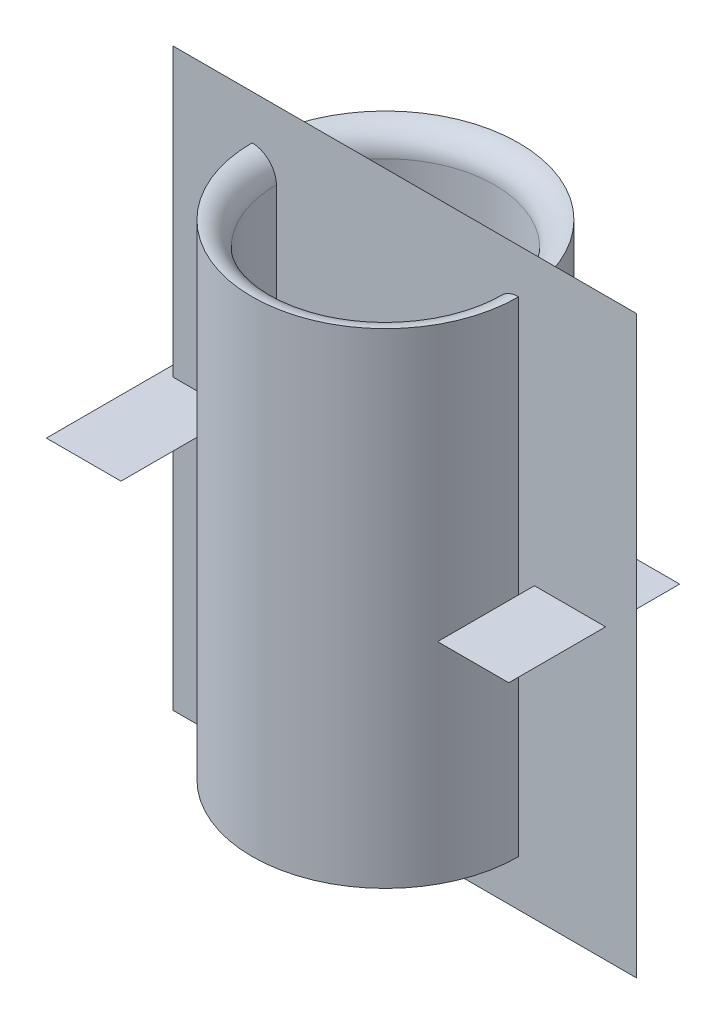
ISO-10303-21;
HEADER;
FILE_DESCRIPTION(('STEP AP214'),'2;1');
FILE_NAME('part.step','',(''),(''),'','','');
FILE_SCHEMA(('AUTOMOTIVE_DESIGN { 1 0 10303 214 1 1 1 1 }'));
ENDSEC;
DATA;
#1=APPLICATION_CONTEXT('core data for automotive mechanical design processes');
#2=APPLICATION_PROTOCOL_DEFINITION('international standard','automotive_design',2000,#1);
#3=PRODUCT_CONTEXT('',#1,'mechanical');
#4=PRODUCT('Part','Part','',(#3));
#5=PRODUCT_RELATED_PRODUCT_CATEGORY('part','',(#4));
#6=PRODUCT_DEFINITION_FORMATION('','',#4);
#7=PRODUCT_DEFINITION_CONTEXT('part definition',#1,'design');
#8=PRODUCT_DEFINITION('design','',#6,#7);
#9=PRODUCT_DEFINITION_SHAPE('','',#8);
#10=(LENGTH_UNIT() NAMED_UNIT(*) SI_UNIT(.MILLI.,.METRE.));
#11=(NAMED_UNIT(*) PLANE_ANGLE_UNIT() SI_UNIT($,.RADIAN.));
#12=(NAMED_UNIT(*) SI_UNIT($,.STERADIAN.) SOLID_ANGLE_UNIT());
#13=UNCERTAINTY_MEASURE_WITH_UNIT(LENGTH_MEASURE(1.E-05),#10,'distance_accuracy_value','');
#14=(GEOMETRIC_REPRESENTATION_CONTEXT(3) GLOBAL_UNCERTAINTY_ASSIGNED_CONTEXT((#13)) GLOBAL_UNIT_ASSIGNED_CONTEXT((#10,
#11,#12)) REPRESENTATION_CONTEXT('',''));
#15=CARTESIAN_POINT('',(0.,0.,0.));
#16=DIRECTION('',(0.,0.,1.));
#17=DIRECTION('',(1.,0.,0.));
#18=AXIS2_PLACEMENT_3D('',#15,#16,#17);
#19=CARTESIAN_POINT('',(0.,0.,0.));
#20=DIRECTION('',(0.,1.,0.));
#21=DIRECTION('',(0.,0.,1.));
#22=AXIS2_PLACEMENT_3D('',#19,#20,#21);
#23=PLANE('',#22);
#24=DIRECTION('',(0.,0.,1.));
#25=VECTOR('',#24,1.);
#26=CARTESIAN_POINT('',(-91.9605176462784,0.,-36.6536783230651));
#27=LINE('',#26,#25);
#28=CARTESIAN_POINT('',(-91.9605176462784,0.,-36.6536783230651));
#29=VERTEX_POINT('',#28);
#30=CARTESIAN_POINT('',(-91.9605176462784,0.,47.9317331917005));
#31=VERTEX_POINT('',#30);
#32=EDGE_CURVE('E79',#29,#31,#27,.T.);
#33=ORIENTED_EDGE('',*,*,#32,.T.);
#34=DIRECTION('',(1.,0.,0.));
#35=VECTOR('',#34,1.);
#36=CARTESIAN_POINT('',(-91.9605176462784,0.,47.9317331917005));
#37=LINE('',#36,#35);
#38=CARTESIAN_POINT('',(-61.1808262339609,0.,47.9317331917005));
#39=VERTEX_POINT('',#38);
#40=EDGE_CURVE('E90',#31,#39,#37,.T.);
#41=ORIENTED_EDGE('',*,*,#40,.T.);
#42=DIRECTION('',(0.,0.,-1.));
#43=VECTOR('',#42,1.);
#44=CARTESIAN_POINT('',(-61.1808262339609,0.,-36.6536783230651));
#45=LINE('',#44,#43);
#46=CARTESIAN_POINT('',(-61.1808262339609,0.,-36.6536783230651));
#47=VERTEX_POINT('',#46);
#48=EDGE_CURVE('E75',#39,#47,#45,.T.);
#49=ORIENTED_EDGE('',*,*,#48,.T.);
#50=DIRECTION('',(-1.,0.,0.));
#51=VECTOR('',#50,1.);
#52=CARTESIAN_POINT('',(-91.9605176462784,0.,-36.6536783230651));
#53=LINE('',#52,#51);
#54=EDGE_CURVE('E14',#47,#29,#53,.T.);
#55=ORIENTED_EDGE('',*,*,#54,.T.);
#56=EDGE_LOOP('',(#33,#41,#49,#55));
#57=FACE_BOUND('',#56,.T.);
#58=ADVANCED_FACE('F70',(#57),#23,.T.);
#59=OPEN_SHELL('',(#58));
#60=SHELL_BASED_SURFACE_MODEL('B2',(#59));
#61=CARTESIAN_POINT('',(0.,0.,0.));
#62=DIRECTION('',(0.,1.,0.));
#63=DIRECTION('',(0.,0.,1.));
#64=AXIS2_PLACEMENT_3D('',#61,#62,#63);
#65=PLANE('',#64);
#66=DIRECTION('',(0.,0.,1.));
#67=VECTOR('',#66,1.);
#68=CARTESIAN_POINT('',(61.4680204624491,0.,-30.5447319358876));
#69=LINE('',#68,#67);
#70=CARTESIAN_POINT('',(61.4680204624491,0.,-30.5447319358876));
#71=VERTEX_POINT('',#70);
#72=CARTESIAN_POINT('',(61.4680204624491,0.,39.9431109930837));
#73=VERTEX_POINT('',#72);
#74=EDGE_CURVE('E133',#71,#73,#69,.T.);
#75=ORIENTED_EDGE('',*,*,#74,.T.);
#76=DIRECTION('',(1.,0.,0.));
#77=VECTOR('',#76,1.);
#78=CARTESIAN_POINT('',(61.4680204624491,0.,39.9431109930837));
#79=LINE('',#78,#77);
#80=CARTESIAN_POINT('',(90.8379550161872,0.,39.9431109930837));
#81=VERTEX_POINT('',#80);
#82=EDGE_CURVE('E144',#73,#81,#79,.T.);
#83=ORIENTED_EDGE('',*,*,#82,.T.);
#84=DIRECTION('',(0.,0.,-1.));
#85=VECTOR('',#84,1.);
#86=CARTESIAN_POINT('',(90.8379550161872,0.,-30.5447319358876));
#87=LINE('',#86,#85);
#88=CARTESIAN_POINT('',(90.8379550161872,0.,-30.5447319358876));
#89=VERTEX_POINT('',#88);
#90=EDGE_CURVE('E129',#81,#89,#87,.T.);
#91=ORIENTED_EDGE('',*,*,#90,.T.);
#92=DIRECTION('',(-1.,0.,0.));
#93=VECTOR('',#92,1.);
#94=CARTESIAN_POINT('',(61.4680204624491,0.,-30.5447319358876));
#95=LINE('',#94,#93);
#96=EDGE_CURVE('E68',#89,#71,#95,.T.);
#97=ORIENTED_EDGE('',*,*,#96,.T.);
#98=EDGE_LOOP('',(#75,#83,#91,#97));
#99=FACE_BOUND('',#98,.T.);
#100=ADVANCED_FACE('F124',(#99),#65,.T.);
#101=OPEN_SHELL('',(#100));
#102=SHELL_BASED_SURFACE_MODEL('B8',(#101));
#103=CARTESIAN_POINT('',(103.619133072208,-119.076130823311,0.));
#104=CARTESIAN_POINT('',(39.8828707405,-119.076130823311,0.));
#105=CARTESIAN_POINT('',(-23.8533915912082,-119.076130823311,0.));
#106=CARTESIAN_POINT('',(-87.5896539229163,-119.076130823311,0.));
#107=CARTESIAN_POINT('',(103.619133072208,-39.9464797847432,0.));
#108=CARTESIAN_POINT('',(39.8828707405,-39.9464797847432,0.));
#109=CARTESIAN_POINT('',(-23.8533915912082,-39.9464797847432,0.));
#110=CARTESIAN_POINT('',(-87.5896539229163,-39.9464797847432,0.));
#111=CARTESIAN_POINT('',(103.619133072208,39.1831712538246,0.));
#112=CARTESIAN_POINT('',(39.8828707405,39.1831712538246,0.));
#113=CARTESIAN_POINT('',(-23.8533915912082,39.1831712538246,0.));
#114=CARTESIAN_POINT('',(-87.5896539229163,39.1831712538246,0.));
#115=CARTESIAN_POINT('',(103.619133072208,118.312822292392,0.));
#116=CARTESIAN_POINT('',(39.8828707405,118.312822292392,0.));
#117=CARTESIAN_POINT('',(-23.8533915912082,118.312822292392,0.));
#118=CARTESIAN_POINT('',(-87.5896539229163,118.312822292392,0.));
#119=B_SPLINE_SURFACE_WITH_KNOTS('',3,3,((#103,#104,#105,#106),(#107,#108,#109,#110),(#111,#112,
#113,#114),(#115,#116,#117,#118)),.UNSPECIFIED.,.F.,.F.,.F.,(4,4),(4,4),(0.,1.),(0.,1.),.UNSPECIFIED.);
#120=CARTESIAN_POINT('',(103.619133072208,-119.076130823311,0.));
#121=CARTESIAN_POINT('',(103.619133072208,-39.9464797847432,0.));
#122=CARTESIAN_POINT('',(103.619133072208,39.1831712538246,0.));
#123=CARTESIAN_POINT('',(103.619133072208,118.312822292392,0.));
#124=B_SPLINE_CURVE_WITH_KNOTS('',3,(#120,#121,#122,#123),.UNSPECIFIED.,.F.,.F.,(4,4),(0.,1.),.UNSPECIFIED.);
#125=CARTESIAN_POINT('',(103.619133072208,-119.076130823311,0.));
#126=VERTEX_POINT('',#125);
#127=CARTESIAN_POINT('',(103.619133072208,118.312822292392,0.));
#128=VERTEX_POINT('',#127);
#129=EDGE_CURVE('E122',#126,#128,#124,.T.);
#130=CARTESIAN_POINT('',(103.619133072208,118.312822292392,0.));
#131=CARTESIAN_POINT('',(39.8828707405,118.312822292392,0.));
#132=CARTESIAN_POINT('',(-23.8533915912082,118.312822292392,0.));
#133=CARTESIAN_POINT('',(-87.5896539229163,118.312822292392,0.));
#134=B_SPLINE_CURVE_WITH_KNOTS('',3,(#130,#131,#132,#133),.UNSPECIFIED.,.F.,.F.,(4,4),(0.,1.),.UNSPECIFIED.);
#135=CARTESIAN_POINT('',(-87.5896539229163,118.312822292392,0.));
#136=VERTEX_POINT('',#135);
#137=EDGE_CURVE('E186',#128,#136,#134,.T.);
#138=CARTESIAN_POINT('',(-87.5896539229163,-119.076130823311,0.));
#139=CARTESIAN_POINT('',(-87.5896539229163,-39.9464797847432,0.));
#140=CARTESIAN_POINT('',(-87.5896539229163,39.1831712538246,0.));
#141=CARTESIAN_POINT('',(-87.5896539229163,118.312822292392,0.));
#142=B_SPLINE_CURVE_WITH_KNOTS('',3,(#138,#139,#140,#141),.UNSPECIFIED.,.F.,.F.,(4,4),(0.,1.),.UNSPECIFIED.);
#143=CARTESIAN_POINT('',(-87.5896539229163,-119.076130823311,0.));
#144=VERTEX_POINT('',#143);
#145=EDGE_CURVE('E194',#136,#144,#142,.F.);
#146=CARTESIAN_POINT('',(103.619133072208,-119.076130823311,0.));
#147=CARTESIAN_POINT('',(39.8828707405,-119.076130823311,0.));
#148=CARTESIAN_POINT('',(-23.8533915912082,-119.076130823311,0.));
#149=CARTESIAN_POINT('',(-87.5896539229163,-119.076130823311,0.));
#150=B_SPLINE_CURVE_WITH_KNOTS('',3,(#146,#147,#148,#149),.UNSPECIFIED.,.F.,.F.,(4,4),(0.,1.),.UNSPECIFIED.);
#151=EDGE_CURVE('E178',#144,#126,#150,.F.);
#152=ORIENTED_EDGE('',*,*,#129,.T.);
#153=ORIENTED_EDGE('',*,*,#137,.T.);
#154=ORIENTED_EDGE('',*,*,#145,.T.);
#155=ORIENTED_EDGE('',*,*,#151,.T.);
#156=EDGE_LOOP('',(#152,#153,#154,#155));
#157=FACE_BOUND('',#156,.T.);
#158=ADVANCED_FACE('F175',(#157),#119,.T.);
#159=OPEN_SHELL('',(#158));
#160=SHELL_BASED_SURFACE_MODEL('B62',(#159));
#161=CARTESIAN_POINT('',(0.,-110.603092707212,0.));
#162=DIRECTION('',(0.,-1.,0.));
#163=DIRECTION('',(0.,0.,-1.));
#164=AXIS2_PLACEMENT_3D('',#161,#162,#163);
#165=CYLINDRICAL_SURFACE('',#164,44.9999999999999);
#166=CARTESIAN_POINT('',(0.,90.,0.));
#167=DIRECTION('',(0.,1.,0.));
#168=DIRECTION('',(0.,0.,1.));
#169=AXIS2_PLACEMENT_3D('',#166,#167,#168);
#170=CIRCLE('',#169,44.9999999999999);
#171=CARTESIAN_POINT('',(0.,90.,44.9999999999999));
#172=VERTEX_POINT('',#171);
#173=EDGE_CURVE('E174',#172,#172,#170,.T.);
#174=ORIENTED_EDGE('',*,*,#173,.T.);
#175=EDGE_LOOP('',(#174));
#176=FACE_BOUND('',#175,.T.);
#177=CARTESIAN_POINT('',(0.,-100.,0.));
#178=DIRECTION('',(0.,-1.,0.));
#179=DIRECTION('',(0.,0.,-1.));
#180=AXIS2_PLACEMENT_3D('',#177,#178,#179);
#181=CIRCLE('',#180,44.9999999999999);
#182=CARTESIAN_POINT('',(0.,-100.,-44.9999999999999));
#183=VERTEX_POINT('',#182);
#184=EDGE_CURVE('E253',#183,#183,#181,.T.);
#185=ORIENTED_EDGE('',*,*,#184,.T.);
#186=EDGE_LOOP('',(#185));
#187=FACE_BOUND('',#186,.T.);
#188=ADVANCED_FACE('F246',(#176,#187),#165,.F.);
#189=CARTESIAN_POINT('',(44.9999999999999,-100.,0.));
#190=DIRECTION('',(0.,-1.,0.));
#191=DIRECTION('',(0.,0.,-1.));
#192=AXIS2_PLACEMENT_3D('',#189,#190,#191);
#193=PLANE('',#192);
#194=CARTESIAN_POINT('',(0.,-100.,0.));
#195=DIRECTION('',(0.,-1.,0.));
#196=DIRECTION('',(0.,0.,-1.));
#197=AXIS2_PLACEMENT_3D('',#194,#195,#196);
#198=CIRCLE('',#197,54.9999999999999);
#199=CARTESIAN_POINT('',(0.,-100.,-54.9999999999999));
#200=VERTEX_POINT('',#199);
#201=EDGE_CURVE('E257',#200,#200,#198,.T.);
#202=ORIENTED_EDGE('',*,*,#201,.T.);
#203=EDGE_LOOP('',(#202));
#204=FACE_BOUND('',#203,.T.);
#205=ORIENTED_EDGE('',*,*,#184,.F.);
#206=EDGE_LOOP('',(#205));
#207=FACE_BOUND('',#206,.T.);
#208=ADVANCED_FACE('F275',(#204,#207),#193,.T.);
#209=CARTESIAN_POINT('',(0.,-110.603092707212,0.));
#210=DIRECTION('',(0.,-1.,0.));
#211=DIRECTION('',(0.,0.,-1.));
#212=AXIS2_PLACEMENT_3D('',#209,#210,#211);
#213=CYLINDRICAL_SURFACE('',#212,54.9999999999999);
#214=CARTESIAN_POINT('',(0.,100.,0.));
#215=DIRECTION('',(0.,-1.,0.));
#216=DIRECTION('',(0.,0.,-1.));
#217=AXIS2_PLACEMENT_3D('',#214,#215,#216);
#218=CIRCLE('',#217,54.9999999999999);
#219=CARTESIAN_POINT('',(0.,100.,-54.9999999999999));
#220=VERTEX_POINT('',#219);
#221=EDGE_CURVE('E261',#220,#220,#218,.T.);
#222=ORIENTED_EDGE('',*,*,#221,.T.);
#223=EDGE_LOOP('',(#222));
#224=FACE_BOUND('',#223,.T.);
#225=ORIENTED_EDGE('',*,*,#201,.F.);
#226=EDGE_LOOP('',(#225));
#227=FACE_BOUND('',#226,.T.);
#228=ADVANCED_FACE('F267',(#224,#227),#213,.T.);
#229=CARTESIAN_POINT('',(0.,90.,0.));
#230=DIRECTION('',(0.,1.,0.));
#231=DIRECTION('',(0.,0.,1.));
#232=AXIS2_PLACEMENT_3D('',#229,#230,#231);
#233=TOROIDAL_SURFACE('',#232,54.9999999999999,10.);
#234=ORIENTED_EDGE('',*,*,#173,.F.);
#235=EDGE_LOOP('',(#234));
#236=FACE_BOUND('',#235,.T.);
#237=ORIENTED_EDGE('',*,*,#221,.F.);
#238=EDGE_LOOP('',(#237));
#239=FACE_BOUND('',#238,.T.);
#240=ADVANCED_FACE('F248',(#236,#239),#233,.T.);
#241=CLOSED_SHELL('',(#188,#208,#228,#240));
#242=MANIFOLD_SOLID_BREP('B116',#241);
#243=ADVANCED_BREP_SHAPE_REPRESENTATION('',(#18,#242),#14);
#244=MANIFOLD_SURFACE_SHAPE_REPRESENTATION('',(#18,#60,#102,#160),#14);
#245=SHAPE_REPRESENTATION('',(#18),#14);
#246=SHAPE_DEFINITION_REPRESENTATION(#9,#245);
#247=SHAPE_REPRESENTATION_RELATIONSHIP('','',#245,#243);
#248=SHAPE_REPRESENTATION_RELATIONSHIP('','',#245,#244);
ENDSEC;
END-ISO-10303-21;
